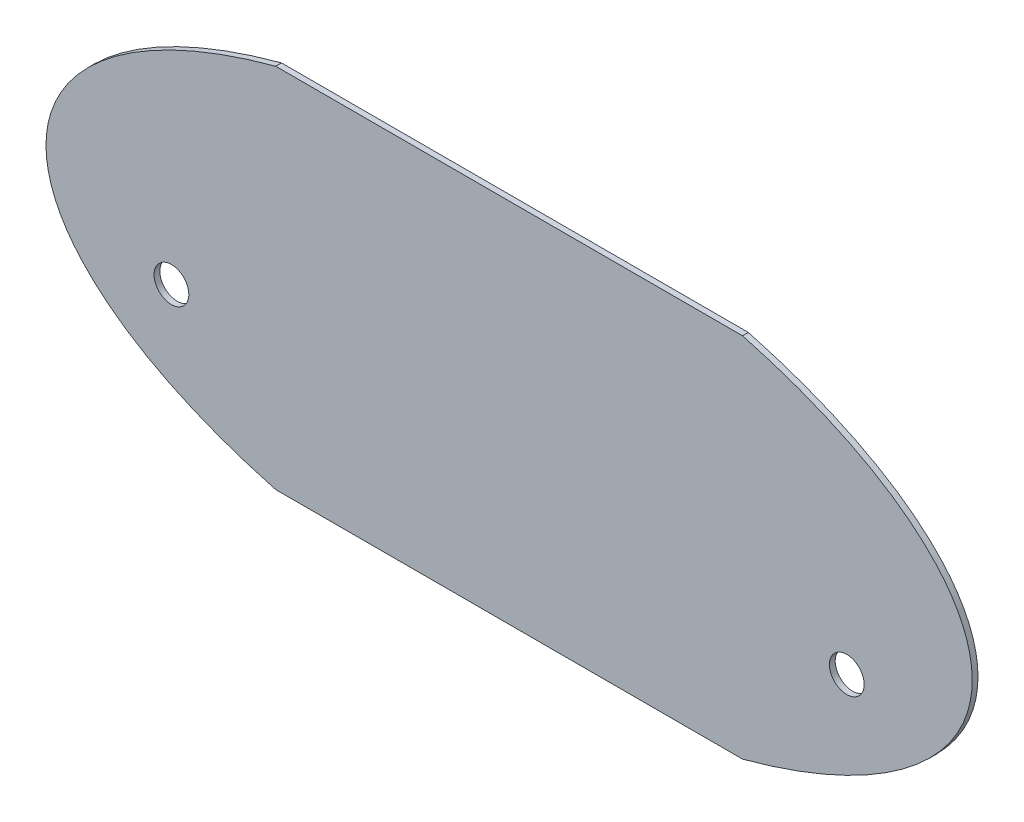
ISO-10303-21;
HEADER;
FILE_DESCRIPTION(('STEP AP214'),'2;1');
FILE_NAME('part.step','',(''),(''),'','','');
FILE_SCHEMA(('AUTOMOTIVE_DESIGN { 1 0 10303 214 1 1 1 1 }'));
ENDSEC;
DATA;
#1=APPLICATION_CONTEXT('core data for automotive mechanical design processes');
#2=APPLICATION_PROTOCOL_DEFINITION('international standard','automotive_design',2000,#1);
#3=PRODUCT_CONTEXT('',#1,'mechanical');
#4=PRODUCT('Part','Part','',(#3));
#5=PRODUCT_RELATED_PRODUCT_CATEGORY('part','',(#4));
#6=PRODUCT_DEFINITION_FORMATION('','',#4);
#7=PRODUCT_DEFINITION_CONTEXT('part definition',#1,'design');
#8=PRODUCT_DEFINITION('design','',#6,#7);
#9=PRODUCT_DEFINITION_SHAPE('','',#8);
#10=(LENGTH_UNIT() NAMED_UNIT(*) SI_UNIT(.MILLI.,.METRE.));
#11=(NAMED_UNIT(*) PLANE_ANGLE_UNIT() SI_UNIT($,.RADIAN.));
#12=(NAMED_UNIT(*) SI_UNIT($,.STERADIAN.) SOLID_ANGLE_UNIT());
#13=UNCERTAINTY_MEASURE_WITH_UNIT(LENGTH_MEASURE(1.E-05),#10,'distance_accuracy_value','');
#14=(GEOMETRIC_REPRESENTATION_CONTEXT(3) GLOBAL_UNCERTAINTY_ASSIGNED_CONTEXT((#13)) GLOBAL_UNIT_ASSIGNED_CONTEXT((#10,
#11,#12)) REPRESENTATION_CONTEXT('',''));
#15=CARTESIAN_POINT('',(0.,0.,0.));
#16=DIRECTION('',(0.,0.,1.));
#17=DIRECTION('',(1.,0.,0.));
#18=AXIS2_PLACEMENT_3D('',#15,#16,#17);
#19=CARTESIAN_POINT('',(0.,0.,-3.));
#20=DIRECTION('',(0.,0.,1.));
#21=DIRECTION('',(1.,0.,0.));
#22=AXIS2_PLACEMENT_3D('',#19,#20,#21);
#23=ELLIPSE('',#22,240.,110.);
#24=DIRECTION('',(0.,0.,1.));
#25=VECTOR('',#24,1.);
#26=SURFACE_OF_LINEAR_EXTRUSION('',#23,#25);
#27=DIRECTION('',(0.,0.,1.));
#28=VECTOR('',#27,1.);
#29=CARTESIAN_POINT('',(-120.987670979012,-95.,-3.));
#30=LINE('',#29,#28);
#31=CARTESIAN_POINT('',(-120.987670979012,-95.,0.));
#32=VERTEX_POINT('',#31);
#33=CARTESIAN_POINT('',(-120.987670979012,-95.,-3.));
#34=VERTEX_POINT('',#33);
#35=EDGE_CURVE('E103',#32,#34,#30,.F.);
#36=ORIENTED_EDGE('',*,*,#35,.F.);
#37=CARTESIAN_POINT('',(0.,0.,0.));
#38=DIRECTION('',(0.,0.,1.));
#39=DIRECTION('',(1.,0.,0.));
#40=AXIS2_PLACEMENT_3D('',#37,#38,#39);
#41=ELLIPSE('',#40,240.,110.);
#42=CARTESIAN_POINT('',(-120.987670979012,95.,0.));
#43=VERTEX_POINT('',#42);
#44=EDGE_CURVE('E91',#43,#32,#41,.T.);
#45=ORIENTED_EDGE('',*,*,#44,.F.);
#46=DIRECTION('',(0.,0.,1.));
#47=VECTOR('',#46,1.);
#48=CARTESIAN_POINT('',(-120.987670979012,95.,-3.));
#49=LINE('',#48,#47);
#50=CARTESIAN_POINT('',(-120.987670979012,95.,-3.));
#51=VERTEX_POINT('',#50);
#52=EDGE_CURVE('E58',#51,#43,#49,.T.);
#53=ORIENTED_EDGE('',*,*,#52,.F.);
#54=EDGE_CURVE('E81',#51,#34,#23,.T.);
#55=ORIENTED_EDGE('',*,*,#54,.T.);
#56=EDGE_LOOP('',(#36,#45,#53,#55));
#57=FACE_BOUND('',#56,.T.);
#58=ADVANCED_FACE('F35',(#57),#26,.T.);
#59=DIRECTION('',(0.,0.,1.));
#60=VECTOR('',#59,1.);
#61=CARTESIAN_POINT('',(120.987670979012,-95.,-3.));
#62=LINE('',#61,#60);
#63=CARTESIAN_POINT('',(120.987670979012,-95.,-3.));
#64=VERTEX_POINT('',#63);
#65=CARTESIAN_POINT('',(120.987670979012,-95.,0.));
#66=VERTEX_POINT('',#65);
#67=EDGE_CURVE('E50',#64,#66,#62,.T.);
#68=ORIENTED_EDGE('',*,*,#67,.F.);
#69=CARTESIAN_POINT('',(120.987670979012,95.,-3.));
#70=VERTEX_POINT('',#69);
#71=EDGE_CURVE('E87',#64,#70,#23,.T.);
#72=ORIENTED_EDGE('',*,*,#71,.T.);
#73=DIRECTION('',(0.,0.,1.));
#74=VECTOR('',#73,1.);
#75=CARTESIAN_POINT('',(120.987670979012,95.,-3.));
#76=LINE('',#75,#74);
#77=CARTESIAN_POINT('',(120.987670979012,95.,0.));
#78=VERTEX_POINT('',#77);
#79=EDGE_CURVE('E75',#78,#70,#76,.F.);
#80=ORIENTED_EDGE('',*,*,#79,.F.);
#81=EDGE_CURVE('E85',#66,#78,#41,.T.);
#82=ORIENTED_EDGE('',*,*,#81,.F.);
#83=EDGE_LOOP('',(#68,#72,#80,#82));
#84=FACE_BOUND('',#83,.T.);
#85=ADVANCED_FACE('F37',(#84),#26,.T.);
#86=CARTESIAN_POINT('',(0.,0.,-3.));
#87=DIRECTION('',(0.,0.,1.));
#88=DIRECTION('',(1.,0.,0.));
#89=AXIS2_PLACEMENT_3D('',#86,#87,#88);
#90=PLANE('',#89);
#91=CARTESIAN_POINT('',(175.,-30.,-3.));
#92=DIRECTION('',(0.,0.,1.));
#93=DIRECTION('',(1.,0.,0.));
#94=AXIS2_PLACEMENT_3D('',#91,#92,#93);
#95=CIRCLE('',#94,9.00000000000001);
#96=CARTESIAN_POINT('',(184.,-30.,-3.));
#97=VERTEX_POINT('',#96);
#98=EDGE_CURVE('E92',#97,#97,#95,.T.);
#99=ORIENTED_EDGE('',*,*,#98,.T.);
#100=EDGE_LOOP('',(#99));
#101=FACE_BOUND('',#100,.T.);
#102=CARTESIAN_POINT('',(-175.,-30.,-3.));
#103=DIRECTION('',(0.,0.,1.));
#104=DIRECTION('',(-1.,0.,0.));
#105=AXIS2_PLACEMENT_3D('',#102,#103,#104);
#106=CIRCLE('',#105,9.00000000000001);
#107=CARTESIAN_POINT('',(-184.,-30.,-3.));
#108=VERTEX_POINT('',#107);
#109=EDGE_CURVE('E102',#108,#108,#106,.T.);
#110=ORIENTED_EDGE('',*,*,#109,.T.);
#111=EDGE_LOOP('',(#110));
#112=FACE_BOUND('',#111,.T.);
#113=ORIENTED_EDGE('',*,*,#71,.F.);
#114=DIRECTION('',(-1.,0.,0.));
#115=VECTOR('',#114,1.);
#116=CARTESIAN_POINT('',(240.,-95.,-3.));
#117=LINE('',#116,#115);
#118=EDGE_CURVE('E111',#64,#34,#117,.T.);
#119=ORIENTED_EDGE('',*,*,#118,.T.);
#120=ORIENTED_EDGE('',*,*,#54,.F.);
#121=DIRECTION('',(1.,0.,0.));
#122=VECTOR('',#121,1.);
#123=CARTESIAN_POINT('',(-240.,95.,-3.));
#124=LINE('',#123,#122);
#125=EDGE_CURVE('E112',#51,#70,#124,.T.);
#126=ORIENTED_EDGE('',*,*,#125,.T.);
#127=EDGE_LOOP('',(#113,#119,#120,#126));
#128=FACE_BOUND('',#127,.T.);
#129=ADVANCED_FACE('F118',(#101,#112,#128),#90,.F.);
#130=CARTESIAN_POINT('',(0.,0.,0.));
#131=DIRECTION('',(0.,0.,1.));
#132=DIRECTION('',(1.,0.,0.));
#133=AXIS2_PLACEMENT_3D('',#130,#131,#132);
#134=PLANE('',#133);
#135=DIRECTION('',(-1.,0.,0.));
#136=VECTOR('',#135,1.);
#137=CARTESIAN_POINT('',(0.,-95.,0.));
#138=LINE('',#137,#136);
#139=EDGE_CURVE('E11',#66,#32,#138,.T.);
#140=ORIENTED_EDGE('',*,*,#139,.F.);
#141=ORIENTED_EDGE('',*,*,#81,.T.);
#142=DIRECTION('',(1.,0.,0.));
#143=VECTOR('',#142,1.);
#144=CARTESIAN_POINT('',(0.,95.,0.));
#145=LINE('',#144,#143);
#146=EDGE_CURVE('E44',#43,#78,#145,.T.);
#147=ORIENTED_EDGE('',*,*,#146,.F.);
#148=ORIENTED_EDGE('',*,*,#44,.T.);
#149=EDGE_LOOP('',(#140,#141,#147,#148));
#150=FACE_BOUND('',#149,.T.);
#151=CARTESIAN_POINT('',(175.,-30.,0.));
#152=DIRECTION('',(0.,0.,1.));
#153=DIRECTION('',(1.,0.,0.));
#154=AXIS2_PLACEMENT_3D('',#151,#152,#153);
#155=CIRCLE('',#154,9.00000000000001);
#156=CARTESIAN_POINT('',(184.,-30.,0.));
#157=VERTEX_POINT('',#156);
#158=EDGE_CURVE('E95',#157,#157,#155,.T.);
#159=ORIENTED_EDGE('',*,*,#158,.F.);
#160=EDGE_LOOP('',(#159));
#161=FACE_BOUND('',#160,.T.);
#162=CARTESIAN_POINT('',(-175.,-30.,0.));
#163=DIRECTION('',(0.,0.,1.));
#164=DIRECTION('',(-1.,0.,0.));
#165=AXIS2_PLACEMENT_3D('',#162,#163,#164);
#166=CIRCLE('',#165,9.00000000000001);
#167=CARTESIAN_POINT('',(-184.,-30.,0.));
#168=VERTEX_POINT('',#167);
#169=EDGE_CURVE('E99',#168,#168,#166,.T.);
#170=ORIENTED_EDGE('',*,*,#169,.F.);
#171=EDGE_LOOP('',(#170));
#172=FACE_BOUND('',#171,.T.);
#173=ADVANCED_FACE('F89',(#150,#161,#172),#134,.T.);
#174=CARTESIAN_POINT('',(-175.,-30.,-3.));
#175=DIRECTION('',(0.,0.,1.));
#176=DIRECTION('',(1.,0.,0.));
#177=AXIS2_PLACEMENT_3D('',#174,#175,#176);
#178=CYLINDRICAL_SURFACE('',#177,9.00000000000001);
#179=ORIENTED_EDGE('',*,*,#109,.F.);
#180=EDGE_LOOP('',(#179));
#181=FACE_BOUND('',#180,.T.);
#182=ORIENTED_EDGE('',*,*,#169,.T.);
#183=EDGE_LOOP('',(#182));
#184=FACE_BOUND('',#183,.T.);
#185=ADVANCED_FACE('F141',(#181,#184),#178,.F.);
#186=CARTESIAN_POINT('',(175.,-30.,-3.));
#187=DIRECTION('',(0.,0.,1.));
#188=DIRECTION('',(1.,0.,0.));
#189=AXIS2_PLACEMENT_3D('',#186,#187,#188);
#190=CYLINDRICAL_SURFACE('',#189,9.00000000000001);
#191=ORIENTED_EDGE('',*,*,#98,.F.);
#192=EDGE_LOOP('',(#191));
#193=FACE_BOUND('',#192,.T.);
#194=ORIENTED_EDGE('',*,*,#158,.T.);
#195=EDGE_LOOP('',(#194));
#196=FACE_BOUND('',#195,.T.);
#197=ADVANCED_FACE('F127',(#193,#196),#190,.F.);
#198=CARTESIAN_POINT('',(-240.,95.,-3.));
#199=DIRECTION('',(0.,-1.,0.));
#200=DIRECTION('',(0.,0.,-1.));
#201=AXIS2_PLACEMENT_3D('',#198,#199,#200);
#202=PLANE('',#201);
#203=ORIENTED_EDGE('',*,*,#79,.T.);
#204=ORIENTED_EDGE('',*,*,#125,.F.);
#205=ORIENTED_EDGE('',*,*,#52,.T.);
#206=ORIENTED_EDGE('',*,*,#146,.T.);
#207=EDGE_LOOP('',(#203,#204,#205,#206));
#208=FACE_BOUND('',#207,.T.);
#209=ADVANCED_FACE('F74',(#208),#202,.F.);
#210=CARTESIAN_POINT('',(240.,-95.,-3.));
#211=DIRECTION('',(0.,1.,0.));
#212=DIRECTION('',(-1.,0.,0.));
#213=AXIS2_PLACEMENT_3D('',#210,#211,#212);
#214=PLANE('',#213);
#215=ORIENTED_EDGE('',*,*,#35,.T.);
#216=ORIENTED_EDGE('',*,*,#118,.F.);
#217=ORIENTED_EDGE('',*,*,#67,.T.);
#218=ORIENTED_EDGE('',*,*,#139,.T.);
#219=EDGE_LOOP('',(#215,#216,#217,#218));
#220=FACE_BOUND('',#219,.T.);
#221=ADVANCED_FACE('F121',(#220),#214,.F.);
#222=CLOSED_SHELL('',(#58,#85,#129,#173,#185,#197,#209,#221));
#223=MANIFOLD_SOLID_BREP('B2',#222);
#224=ADVANCED_BREP_SHAPE_REPRESENTATION('',(#18,#223),#14);
#225=SHAPE_DEFINITION_REPRESENTATION(#9,#224);
ENDSEC;
END-ISO-10303-21;
